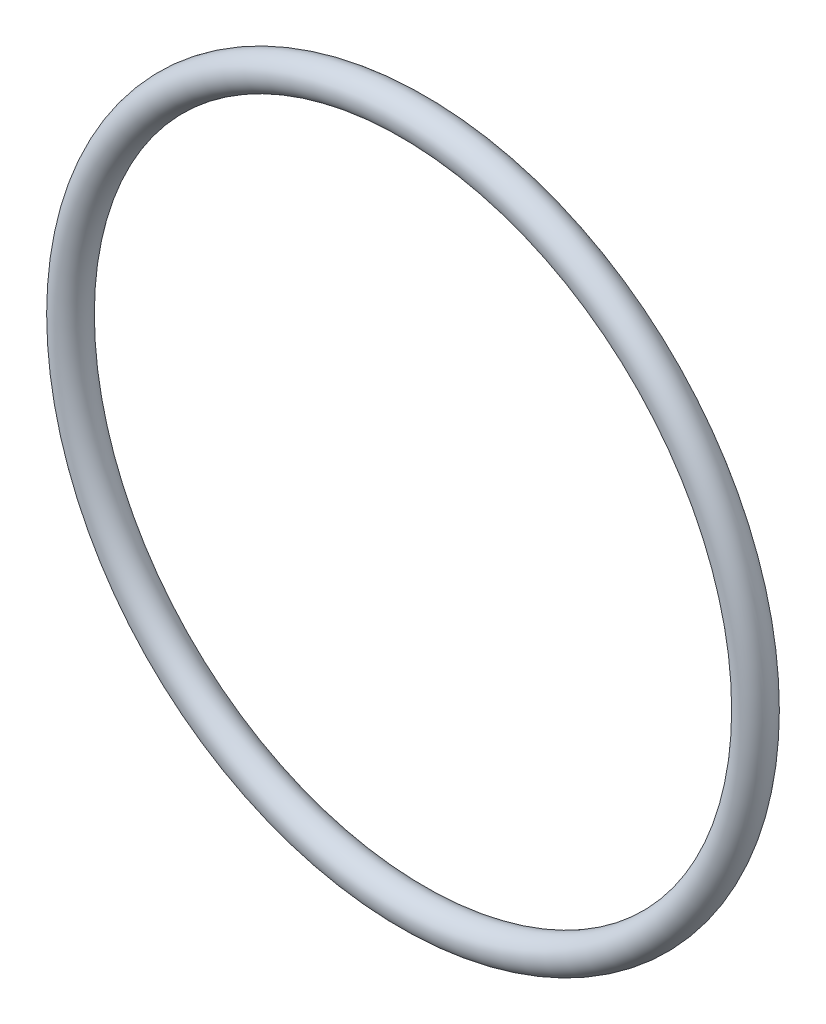
ISO-10303-21;
HEADER;
FILE_DESCRIPTION(('STEP AP214'),'2;1');
FILE_NAME('part.step','',(''),(''),'','','');
FILE_SCHEMA(('AUTOMOTIVE_DESIGN { 1 0 10303 214 1 1 1 1 }'));
ENDSEC;
DATA;
#1=APPLICATION_CONTEXT('core data for automotive mechanical design processes');
#2=APPLICATION_PROTOCOL_DEFINITION('international standard','automotive_design',2000,#1);
#3=PRODUCT_CONTEXT('',#1,'mechanical');
#4=PRODUCT('Part','Part','',(#3));
#5=PRODUCT_RELATED_PRODUCT_CATEGORY('part','',(#4));
#6=PRODUCT_DEFINITION_FORMATION('','',#4);
#7=PRODUCT_DEFINITION_CONTEXT('part definition',#1,'design');
#8=PRODUCT_DEFINITION('design','',#6,#7);
#9=PRODUCT_DEFINITION_SHAPE('','',#8);
#10=(LENGTH_UNIT() NAMED_UNIT(*) SI_UNIT(.MILLI.,.METRE.));
#11=(NAMED_UNIT(*) PLANE_ANGLE_UNIT() SI_UNIT($,.RADIAN.));
#12=(NAMED_UNIT(*) SI_UNIT($,.STERADIAN.) SOLID_ANGLE_UNIT());
#13=UNCERTAINTY_MEASURE_WITH_UNIT(LENGTH_MEASURE(1.E-05),#10,'distance_accuracy_value','');
#14=(GEOMETRIC_REPRESENTATION_CONTEXT(3) GLOBAL_UNCERTAINTY_ASSIGNED_CONTEXT((#13)) GLOBAL_UNIT_ASSIGNED_CONTEXT((#10,
#11,#12)) REPRESENTATION_CONTEXT('',''));
#15=CARTESIAN_POINT('',(0.,0.,0.));
#16=DIRECTION('',(0.,0.,1.));
#17=DIRECTION('',(1.,0.,0.));
#18=AXIS2_PLACEMENT_3D('',#15,#16,#17);
#19=CARTESIAN_POINT('',(0.,0.,0.));
#20=DIRECTION('',(0.,0.,1.));
#21=DIRECTION('',(1.,0.,0.));
#22=AXIS2_PLACEMENT_3D('',#19,#20,#21);
#23=TOROIDAL_SURFACE('',#22,26.543,1.3081);
#24=CARTESIAN_POINT('',(27.8511,0.,0.));
#25=VERTEX_POINT('',#24);
#26=VERTEX_LOOP('',#25);
#27=FACE_BOUND('',#26,.T.);
#28=ADVANCED_FACE('F32',(#27),#23,.T.);
#29=CLOSED_SHELL('',(#28));
#30=MANIFOLD_SOLID_BREP('B2',#29);
#31=ADVANCED_BREP_SHAPE_REPRESENTATION('',(#18,#30),#14);
#32=SHAPE_DEFINITION_REPRESENTATION(#9,#31);
ENDSEC;
END-ISO-10303-21;
